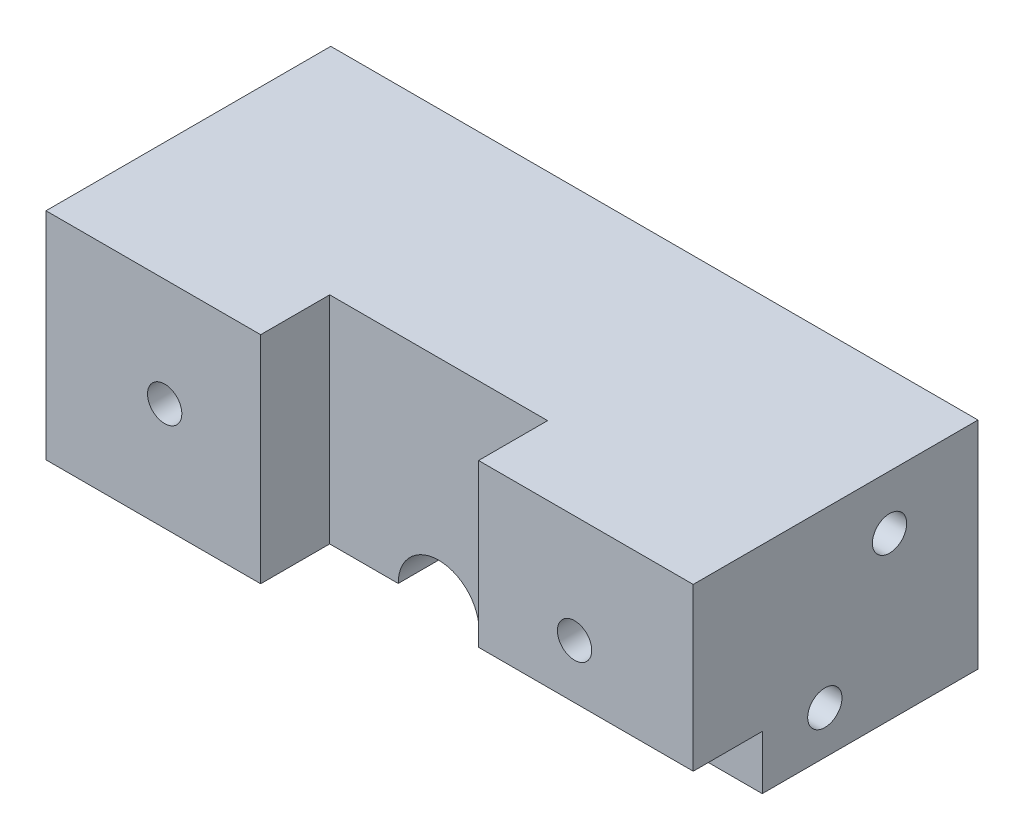
ISO-10303-21;
HEADER;
FILE_DESCRIPTION(('STEP AP214'),'2;1');
FILE_NAME('part.step','',(''),(''),'','','');
FILE_SCHEMA(('AUTOMOTIVE_DESIGN { 1 0 10303 214 1 1 1 1 }'));
ENDSEC;
DATA;
#1=APPLICATION_CONTEXT('core data for automotive mechanical design processes');
#2=APPLICATION_PROTOCOL_DEFINITION('international standard','automotive_design',2000,#1);
#3=PRODUCT_CONTEXT('',#1,'mechanical');
#4=PRODUCT('Part','Part','',(#3));
#5=PRODUCT_RELATED_PRODUCT_CATEGORY('part','',(#4));
#6=PRODUCT_DEFINITION_FORMATION('','',#4);
#7=PRODUCT_DEFINITION_CONTEXT('part definition',#1,'design');
#8=PRODUCT_DEFINITION('design','',#6,#7);
#9=PRODUCT_DEFINITION_SHAPE('','',#8);
#10=(LENGTH_UNIT() NAMED_UNIT(*) SI_UNIT(.MILLI.,.METRE.));
#11=(NAMED_UNIT(*) PLANE_ANGLE_UNIT() SI_UNIT($,.RADIAN.));
#12=(NAMED_UNIT(*) SI_UNIT($,.STERADIAN.) SOLID_ANGLE_UNIT());
#13=UNCERTAINTY_MEASURE_WITH_UNIT(LENGTH_MEASURE(1.E-05),#10,'distance_accuracy_value','');
#14=(GEOMETRIC_REPRESENTATION_CONTEXT(3) GLOBAL_UNCERTAINTY_ASSIGNED_CONTEXT((#13)) GLOBAL_UNIT_ASSIGNED_CONTEXT((#10,
#11,#12)) REPRESENTATION_CONTEXT('',''));
#15=CARTESIAN_POINT('',(0.,0.,0.));
#16=DIRECTION('',(0.,0.,1.));
#17=DIRECTION('',(1.,0.,0.));
#18=AXIS2_PLACEMENT_3D('',#15,#16,#17);
#19=CARTESIAN_POINT('',(0.,0.,-40.005));
#20=DIRECTION('',(0.,0.,-1.));
#21=DIRECTION('',(-1.,0.,0.));
#22=AXIS2_PLACEMENT_3D('',#19,#20,#21);
#23=PLANE('',#22);
#24=DIRECTION('',(0.,1.,0.));
#25=VECTOR('',#24,1.);
#26=CARTESIAN_POINT('',(38.1,-12.7,-40.005));
#27=LINE('',#26,#25);
#28=CARTESIAN_POINT('',(38.1,-6.35,-40.005));
#29=VERTEX_POINT('',#28);
#30=CARTESIAN_POINT('',(38.1,12.7,-40.005));
#31=VERTEX_POINT('',#30);
#32=EDGE_CURVE('E244',#29,#31,#27,.T.);
#33=ORIENTED_EDGE('',*,*,#32,.T.);
#34=DIRECTION('',(1.,0.,0.));
#35=VECTOR('',#34,1.);
#36=CARTESIAN_POINT('',(0.,12.7,-40.005));
#37=LINE('',#36,#35);
#38=CARTESIAN_POINT('',(12.827,12.7,-40.005));
#39=VERTEX_POINT('',#38);
#40=EDGE_CURVE('E243',#39,#31,#37,.T.);
#41=ORIENTED_EDGE('',*,*,#40,.F.);
#42=DIRECTION('',(0.,-1.,0.));
#43=VECTOR('',#42,1.);
#44=CARTESIAN_POINT('',(12.827,12.7,-40.005));
#45=LINE('',#44,#43);
#46=CARTESIAN_POINT('',(12.827,-6.35,-40.005));
#47=VERTEX_POINT('',#46);
#48=EDGE_CURVE('E11',#39,#47,#45,.T.);
#49=ORIENTED_EDGE('',*,*,#48,.T.);
#50=DIRECTION('',(-1.,0.,0.));
#51=VECTOR('',#50,1.);
#52=CARTESIAN_POINT('',(12.827,-6.35,-40.005));
#53=LINE('',#52,#51);
#54=EDGE_CURVE('E180',#29,#47,#53,.T.);
#55=ORIENTED_EDGE('',*,*,#54,.F.);
#56=EDGE_LOOP('',(#33,#41,#49,#55));
#57=FACE_BOUND('',#56,.T.);
#58=CARTESIAN_POINT('',(24.13,0.,-40.005));
#59=DIRECTION('',(0.,0.,-1.));
#60=DIRECTION('',(-1.,0.,0.));
#61=AXIS2_PLACEMENT_3D('',#58,#59,#60);
#62=CIRCLE('',#61,2.0193);
#63=CARTESIAN_POINT('',(22.1107,0.,-40.005));
#64=VERTEX_POINT('',#63);
#65=EDGE_CURVE('E249',#64,#64,#62,.F.);
#66=ORIENTED_EDGE('',*,*,#65,.F.);
#67=EDGE_LOOP('',(#66));
#68=FACE_BOUND('',#67,.T.);
#69=ADVANCED_FACE('F36',(#57,#68),#23,.F.);
#70=DIRECTION('',(1.,0.,0.));
#71=VECTOR('',#70,1.);
#72=CARTESIAN_POINT('',(0.,-12.7,-40.005));
#73=LINE('',#72,#71);
#74=CARTESIAN_POINT('',(-38.1,-12.7,-40.0049999999999));
#75=VERTEX_POINT('',#74);
#76=CARTESIAN_POINT('',(-12.827,-12.7,-40.005));
#77=VERTEX_POINT('',#76);
#78=EDGE_CURVE('E39',#75,#77,#73,.T.);
#79=ORIENTED_EDGE('',*,*,#78,.T.);
#80=DIRECTION('',(0.,-1.,0.));
#81=VECTOR('',#80,1.);
#82=CARTESIAN_POINT('',(-12.827,12.7,-40.005));
#83=LINE('',#82,#81);
#84=CARTESIAN_POINT('',(-12.827,12.7,-40.005));
#85=VERTEX_POINT('',#84);
#86=EDGE_CURVE('E203',#85,#77,#83,.T.);
#87=ORIENTED_EDGE('',*,*,#86,.F.);
#88=CARTESIAN_POINT('',(-38.1,12.7,-40.0049999999999));
#89=VERTEX_POINT('',#88);
#90=EDGE_CURVE('E241',#89,#85,#37,.T.);
#91=ORIENTED_EDGE('',*,*,#90,.F.);
#92=DIRECTION('',(0.,-1.,0.));
#93=VECTOR('',#92,1.);
#94=CARTESIAN_POINT('',(-38.1,-12.7,-40.0049999999999));
#95=LINE('',#94,#93);
#96=EDGE_CURVE('E44',#89,#75,#95,.T.);
#97=ORIENTED_EDGE('',*,*,#96,.T.);
#98=EDGE_LOOP('',(#79,#87,#91,#97));
#99=FACE_BOUND('',#98,.T.);
#100=CARTESIAN_POINT('',(-24.13,0.,-40.0049999999999));
#101=DIRECTION('',(0.,0.,-1.));
#102=DIRECTION('',(-1.,0.,0.));
#103=AXIS2_PLACEMENT_3D('',#100,#101,#102);
#104=CIRCLE('',#103,2.0193);
#105=CARTESIAN_POINT('',(-26.1493,0.,-40.0049999999999));
#106=VERTEX_POINT('',#105);
#107=EDGE_CURVE('E236',#106,#106,#104,.F.);
#108=ORIENTED_EDGE('',*,*,#107,.F.);
#109=EDGE_LOOP('',(#108));
#110=FACE_BOUND('',#109,.T.);
#111=ADVANCED_FACE('F254',(#99,#110),#23,.F.);
#112=CARTESIAN_POINT('',(-31.75,0.,-57.658));
#113=DIRECTION('',(0.,-1.,0.));
#114=DIRECTION('',(0.,0.,-1.));
#115=AXIS2_PLACEMENT_3D('',#112,#113,#114);
#116=PLANE('',#115);
#117=CARTESIAN_POINT('',(-31.75,0.,-57.658));
#118=DIRECTION('',(0.,-1.,0.));
#119=DIRECTION('',(0.,0.,-1.));
#120=AXIS2_PLACEMENT_3D('',#117,#118,#119);
#121=CIRCLE('',#120,2.0193);
#122=CARTESIAN_POINT('',(-31.75,0.,-59.6773));
#123=VERTEX_POINT('',#122);
#124=EDGE_CURVE('E152',#123,#123,#121,.T.);
#125=ORIENTED_EDGE('',*,*,#124,.T.);
#126=EDGE_LOOP('',(#125));
#127=FACE_BOUND('',#126,.T.);
#128=ADVANCED_FACE('F520',(#127),#116,.T.);
#129=CARTESIAN_POINT('',(-12.7,0.,-57.658));
#130=DIRECTION('',(0.,-1.,0.));
#131=DIRECTION('',(0.,0.,-1.));
#132=AXIS2_PLACEMENT_3D('',#129,#130,#131);
#133=PLANE('',#132);
#134=CARTESIAN_POINT('',(-12.7,0.,-57.658));
#135=DIRECTION('',(0.,-1.,0.));
#136=DIRECTION('',(0.,0.,-1.));
#137=AXIS2_PLACEMENT_3D('',#134,#135,#136);
#138=CIRCLE('',#137,2.0193);
#139=CARTESIAN_POINT('',(-12.7,0.,-59.6773));
#140=VERTEX_POINT('',#139);
#141=EDGE_CURVE('E146',#140,#140,#138,.T.);
#142=ORIENTED_EDGE('',*,*,#141,.T.);
#143=EDGE_LOOP('',(#142));
#144=FACE_BOUND('',#143,.T.);
#145=ADVANCED_FACE('F511',(#144),#133,.T.);
#146=CARTESIAN_POINT('',(23.9776,-7.62,-55.499));
#147=DIRECTION('',(1.,0.,0.));
#148=DIRECTION('',(0.,0.,-1.));
#149=AXIS2_PLACEMENT_3D('',#146,#147,#148);
#150=CONICAL_SURFACE('',#149,2.01929999999999,1.02974425867665);
#151=CARTESIAN_POINT('',(22.7642821519976,-7.62000000000001,-55.499));
#152=VERTEX_POINT('',#151);
#153=VERTEX_LOOP('',#152);
#154=FACE_BOUND('',#153,.T.);
#155=CARTESIAN_POINT('',(23.9776,-7.62,-55.499));
#156=DIRECTION('',(1.,0.,0.));
#157=DIRECTION('',(0.,0.,-1.));
#158=AXIS2_PLACEMENT_3D('',#155,#156,#157);
#159=CIRCLE('',#158,2.01929999999999);
#160=CARTESIAN_POINT('',(23.9776,-7.62,-57.5183));
#161=VERTEX_POINT('',#160);
#162=EDGE_CURVE('E138',#161,#161,#159,.T.);
#163=ORIENTED_EDGE('',*,*,#162,.T.);
#164=EDGE_LOOP('',(#163));
#165=FACE_BOUND('',#164,.T.);
#166=ADVANCED_FACE('F128',(#154,#165),#150,.F.);
#167=CARTESIAN_POINT('',(23.9776,6.35,-63.119));
#168=DIRECTION('',(1.,0.,0.));
#169=DIRECTION('',(0.,0.,-1.));
#170=AXIS2_PLACEMENT_3D('',#167,#168,#169);
#171=CONICAL_SURFACE('',#170,2.01929999999999,1.02974425867665);
#172=CARTESIAN_POINT('',(22.7642821519976,6.35,-63.119));
#173=VERTEX_POINT('',#172);
#174=VERTEX_LOOP('',#173);
#175=FACE_BOUND('',#174,.T.);
#176=CARTESIAN_POINT('',(23.9776,6.35,-63.119));
#177=DIRECTION('',(1.,0.,0.));
#178=DIRECTION('',(0.,0.,-1.));
#179=AXIS2_PLACEMENT_3D('',#176,#177,#178);
#180=CIRCLE('',#179,2.01929999999999);
#181=CARTESIAN_POINT('',(23.9776,6.35,-65.1383));
#182=VERTEX_POINT('',#181);
#183=EDGE_CURVE('E132',#182,#182,#180,.T.);
#184=ORIENTED_EDGE('',*,*,#183,.T.);
#185=EDGE_LOOP('',(#184));
#186=FACE_BOUND('',#185,.T.);
#187=ADVANCED_FACE('F124',(#175,#186),#171,.F.);
#188=CARTESIAN_POINT('',(24.13,0.,-68.072));
#189=DIRECTION('',(0.,0.,-1.));
#190=DIRECTION('',(-1.,0.,0.));
#191=AXIS2_PLACEMENT_3D('',#188,#189,#190);
#192=CYLINDRICAL_SURFACE('',#191,4.2164);
#193=CARTESIAN_POINT('',(24.13,0.,-68.072));
#194=DIRECTION('',(0.,0.,-1.));
#195=DIRECTION('',(-1.,0.,0.));
#196=AXIS2_PLACEMENT_3D('',#193,#194,#195);
#197=CIRCLE('',#196,4.2164);
#198=CARTESIAN_POINT('',(19.9136,0.,-68.072));
#199=VERTEX_POINT('',#198);
#200=EDGE_CURVE('E164',#199,#199,#197,.T.);
#201=ORIENTED_EDGE('',*,*,#200,.F.);
#202=EDGE_LOOP('',(#201));
#203=FACE_BOUND('',#202,.T.);
#204=CARTESIAN_POINT('',(24.13,0.,-73.533));
#205=DIRECTION('',(0.,0.,-1.));
#206=DIRECTION('',(-1.,0.,0.));
#207=AXIS2_PLACEMENT_3D('',#204,#205,#206);
#208=CIRCLE('',#207,4.2164);
#209=CARTESIAN_POINT('',(19.9136,0.,-73.533));
#210=VERTEX_POINT('',#209);
#211=EDGE_CURVE('E168',#210,#210,#208,.T.);
#212=ORIENTED_EDGE('',*,*,#211,.T.);
#213=EDGE_LOOP('',(#212));
#214=FACE_BOUND('',#213,.T.);
#215=ADVANCED_FACE('F127',(#203,#214),#192,.F.);
#216=CARTESIAN_POINT('',(24.13,0.,-68.072));
#217=DIRECTION('',(0.,0.,-1.));
#218=DIRECTION('',(-1.,0.,0.));
#219=AXIS2_PLACEMENT_3D('',#216,#217,#218);
#220=PLANE('',#219);
#221=ORIENTED_EDGE('',*,*,#200,.T.);
#222=EDGE_LOOP('',(#221));
#223=FACE_BOUND('',#222,.T.);
#224=CARTESIAN_POINT('',(24.13,0.,-68.072));
#225=DIRECTION('',(0.,0.,-1.));
#226=DIRECTION('',(-1.,0.,0.));
#227=AXIS2_PLACEMENT_3D('',#224,#225,#226);
#228=CIRCLE('',#227,2.0193);
#229=CARTESIAN_POINT('',(22.1107,0.,-68.072));
#230=VERTEX_POINT('',#229);
#231=EDGE_CURVE('E167',#230,#230,#228,.F.);
#232=ORIENTED_EDGE('',*,*,#231,.T.);
#233=EDGE_LOOP('',(#232));
#234=FACE_BOUND('',#233,.T.);
#235=ADVANCED_FACE('F308',(#223,#234),#220,.T.);
#236=CARTESIAN_POINT('',(24.13,0.,-16.383));
#237=DIRECTION('',(0.,0.,-1.));
#238=DIRECTION('',(-1.,0.,0.));
#239=AXIS2_PLACEMENT_3D('',#236,#237,#238);
#240=CYLINDRICAL_SURFACE('',#239,2.0193);
#241=ORIENTED_EDGE('',*,*,#65,.T.);
#242=EDGE_LOOP('',(#241));
#243=FACE_BOUND('',#242,.T.);
#244=ORIENTED_EDGE('',*,*,#231,.F.);
#245=EDGE_LOOP('',(#244));
#246=FACE_BOUND('',#245,.T.);
#247=ADVANCED_FACE('F304',(#243,#246),#240,.F.);
#248=CARTESIAN_POINT('',(-24.13,0.,-68.072));
#249=DIRECTION('',(0.,0.,-1.));
#250=DIRECTION('',(-1.,0.,0.));
#251=AXIS2_PLACEMENT_3D('',#248,#249,#250);
#252=CYLINDRICAL_SURFACE('',#251,4.2164);
#253=CARTESIAN_POINT('',(-24.13,0.,-68.072));
#254=DIRECTION('',(0.,0.,-1.));
#255=DIRECTION('',(-1.,0.,0.));
#256=AXIS2_PLACEMENT_3D('',#253,#254,#255);
#257=CIRCLE('',#256,4.2164);
#258=CARTESIAN_POINT('',(-28.3464,0.,-68.072));
#259=VERTEX_POINT('',#258);
#260=EDGE_CURVE('E158',#259,#259,#257,.T.);
#261=ORIENTED_EDGE('',*,*,#260,.F.);
#262=EDGE_LOOP('',(#261));
#263=FACE_BOUND('',#262,.T.);
#264=CARTESIAN_POINT('',(-24.13,0.,-73.533));
#265=DIRECTION('',(0.,0.,-1.));
#266=DIRECTION('',(-1.,0.,0.));
#267=AXIS2_PLACEMENT_3D('',#264,#265,#266);
#268=CIRCLE('',#267,4.2164);
#269=CARTESIAN_POINT('',(-28.3464,0.,-73.533));
#270=VERTEX_POINT('',#269);
#271=EDGE_CURVE('E155',#270,#270,#268,.T.);
#272=ORIENTED_EDGE('',*,*,#271,.T.);
#273=EDGE_LOOP('',(#272));
#274=FACE_BOUND('',#273,.T.);
#275=ADVANCED_FACE('F307',(#263,#274),#252,.F.);
#276=CARTESIAN_POINT('',(-24.13,0.,-68.072));
#277=DIRECTION('',(0.,0.,-1.));
#278=DIRECTION('',(-1.,0.,0.));
#279=AXIS2_PLACEMENT_3D('',#276,#277,#278);
#280=PLANE('',#279);
#281=ORIENTED_EDGE('',*,*,#260,.T.);
#282=EDGE_LOOP('',(#281));
#283=FACE_BOUND('',#282,.T.);
#284=CARTESIAN_POINT('',(-24.13,0.,-68.072));
#285=DIRECTION('',(0.,0.,-1.));
#286=DIRECTION('',(-1.,0.,0.));
#287=AXIS2_PLACEMENT_3D('',#284,#285,#286);
#288=CIRCLE('',#287,2.0193);
#289=CARTESIAN_POINT('',(-26.1493,0.,-68.072));
#290=VERTEX_POINT('',#289);
#291=EDGE_CURVE('E161',#290,#290,#288,.F.);
#292=ORIENTED_EDGE('',*,*,#291,.T.);
#293=EDGE_LOOP('',(#292));
#294=FACE_BOUND('',#293,.T.);
#295=ADVANCED_FACE('F326',(#283,#294),#280,.T.);
#296=CARTESIAN_POINT('',(-24.13,0.,-16.383));
#297=DIRECTION('',(0.,0.,-1.));
#298=DIRECTION('',(-1.,0.,0.));
#299=AXIS2_PLACEMENT_3D('',#296,#297,#298);
#300=CYLINDRICAL_SURFACE('',#299,2.0193);
#301=ORIENTED_EDGE('',*,*,#107,.T.);
#302=EDGE_LOOP('',(#301));
#303=FACE_BOUND('',#302,.T.);
#304=ORIENTED_EDGE('',*,*,#291,.F.);
#305=EDGE_LOOP('',(#304));
#306=FACE_BOUND('',#305,.T.);
#307=ADVANCED_FACE('F323',(#303,#306),#300,.F.);
#308=CARTESIAN_POINT('',(-31.75,0.,-57.658));
#309=DIRECTION('',(0.,-1.,0.));
#310=DIRECTION('',(0.,0.,-1.));
#311=AXIS2_PLACEMENT_3D('',#308,#309,#310);
#312=CYLINDRICAL_SURFACE('',#311,2.0193);
#313=ORIENTED_EDGE('',*,*,#124,.F.);
#314=EDGE_LOOP('',(#313));
#315=FACE_BOUND('',#314,.T.);
#316=CARTESIAN_POINT('',(-31.75,-12.7,-57.658));
#317=DIRECTION('',(0.,-1.,0.));
#318=DIRECTION('',(0.,0.,-1.));
#319=AXIS2_PLACEMENT_3D('',#316,#317,#318);
#320=CIRCLE('',#319,2.0193);
#321=CARTESIAN_POINT('',(-31.75,-12.7,-59.6773));
#322=VERTEX_POINT('',#321);
#323=EDGE_CURVE('E149',#322,#322,#320,.T.);
#324=ORIENTED_EDGE('',*,*,#323,.T.);
#325=EDGE_LOOP('',(#324));
#326=FACE_BOUND('',#325,.T.);
#327=ADVANCED_FACE('F325',(#315,#326),#312,.F.);
#328=CARTESIAN_POINT('',(-12.7,0.,-57.658));
#329=DIRECTION('',(0.,-1.,0.));
#330=DIRECTION('',(0.,0.,-1.));
#331=AXIS2_PLACEMENT_3D('',#328,#329,#330);
#332=CYLINDRICAL_SURFACE('',#331,2.0193);
#333=ORIENTED_EDGE('',*,*,#141,.F.);
#334=EDGE_LOOP('',(#333));
#335=FACE_BOUND('',#334,.T.);
#336=CARTESIAN_POINT('',(-12.7,-12.7,-57.658));
#337=DIRECTION('',(0.,-1.,0.));
#338=DIRECTION('',(0.,0.,-1.));
#339=AXIS2_PLACEMENT_3D('',#336,#337,#338);
#340=CIRCLE('',#339,2.0193);
#341=CARTESIAN_POINT('',(-12.7,-12.7,-59.6773));
#342=VERTEX_POINT('',#341);
#343=EDGE_CURVE('E145',#342,#342,#340,.T.);
#344=ORIENTED_EDGE('',*,*,#343,.T.);
#345=EDGE_LOOP('',(#344));
#346=FACE_BOUND('',#345,.T.);
#347=ADVANCED_FACE('F340',(#335,#346),#332,.F.);
#348=CARTESIAN_POINT('',(0.,-12.7,-48.133));
#349=DIRECTION('',(0.,0.,-1.));
#350=DIRECTION('',(-1.,0.,0.));
#351=AXIS2_PLACEMENT_3D('',#348,#349,#350);
#352=CYLINDRICAL_SURFACE('',#351,4.7625);
#353=DIRECTION('',(0.,0.,-1.));
#354=VECTOR('',#353,1.);
#355=CARTESIAN_POINT('',(-4.7625,-12.7,-48.133));
#356=LINE('',#355,#354);
#357=CARTESIAN_POINT('',(-4.7625,-12.7,-48.133));
#358=VERTEX_POINT('',#357);
#359=CARTESIAN_POINT('',(-4.7625,-12.7,-73.533));
#360=VERTEX_POINT('',#359);
#361=EDGE_CURVE('E234',#358,#360,#356,.T.);
#362=ORIENTED_EDGE('',*,*,#361,.T.);
#363=CARTESIAN_POINT('',(0.,-12.7,-73.533));
#364=DIRECTION('',(0.,0.,-1.));
#365=DIRECTION('',(-1.,0.,0.));
#366=AXIS2_PLACEMENT_3D('',#363,#364,#365);
#367=CIRCLE('',#366,4.7625);
#368=CARTESIAN_POINT('',(4.7625,-12.7,-73.533));
#369=VERTEX_POINT('',#368);
#370=EDGE_CURVE('E206',#360,#369,#367,.T.);
#371=ORIENTED_EDGE('',*,*,#370,.T.);
#372=DIRECTION('',(0.,0.,-1.));
#373=VECTOR('',#372,1.);
#374=CARTESIAN_POINT('',(4.7625,-12.7,-48.133));
#375=LINE('',#374,#373);
#376=CARTESIAN_POINT('',(4.7625,-12.7,-48.133));
#377=VERTEX_POINT('',#376);
#378=EDGE_CURVE('E229',#369,#377,#375,.F.);
#379=ORIENTED_EDGE('',*,*,#378,.T.);
#380=CARTESIAN_POINT('',(0.,-12.7,-48.133));
#381=DIRECTION('',(0.,0.,-1.));
#382=DIRECTION('',(-1.,0.,0.));
#383=AXIS2_PLACEMENT_3D('',#380,#381,#382);
#384=CIRCLE('',#383,4.7625);
#385=EDGE_CURVE('E207',#358,#377,#384,.T.);
#386=ORIENTED_EDGE('',*,*,#385,.F.);
#387=EDGE_LOOP('',(#362,#371,#379,#386));
#388=FACE_BOUND('',#387,.T.);
#389=ADVANCED_FACE('F286',(#388),#352,.F.);
#390=CARTESIAN_POINT('',(38.1,-7.62,-55.499));
#391=DIRECTION('',(1.,0.,0.));
#392=DIRECTION('',(0.,0.,-1.));
#393=AXIS2_PLACEMENT_3D('',#390,#391,#392);
#394=CYLINDRICAL_SURFACE('',#393,2.01929999999999);
#395=ORIENTED_EDGE('',*,*,#162,.F.);
#396=EDGE_LOOP('',(#395));
#397=FACE_BOUND('',#396,.T.);
#398=CARTESIAN_POINT('',(38.1,-7.62,-55.499));
#399=DIRECTION('',(1.,0.,0.));
#400=DIRECTION('',(0.,0.,-1.));
#401=AXIS2_PLACEMENT_3D('',#398,#399,#400);
#402=CIRCLE('',#401,2.01929999999999);
#403=CARTESIAN_POINT('',(38.1,-7.62,-57.5183));
#404=VERTEX_POINT('',#403);
#405=EDGE_CURVE('E134',#404,#404,#402,.T.);
#406=ORIENTED_EDGE('',*,*,#405,.T.);
#407=EDGE_LOOP('',(#406));
#408=FACE_BOUND('',#407,.T.);
#409=ADVANCED_FACE('F339',(#397,#408),#394,.F.);
#410=CARTESIAN_POINT('',(38.1,6.35,-63.119));
#411=DIRECTION('',(1.,0.,0.));
#412=DIRECTION('',(0.,0.,-1.));
#413=AXIS2_PLACEMENT_3D('',#410,#411,#412);
#414=CYLINDRICAL_SURFACE('',#413,2.01929999999999);
#415=ORIENTED_EDGE('',*,*,#183,.F.);
#416=EDGE_LOOP('',(#415));
#417=FACE_BOUND('',#416,.T.);
#418=CARTESIAN_POINT('',(38.1,6.35,-63.119));
#419=DIRECTION('',(1.,0.,0.));
#420=DIRECTION('',(0.,0.,-1.));
#421=AXIS2_PLACEMENT_3D('',#418,#419,#420);
#422=CIRCLE('',#421,2.01929999999999);
#423=CARTESIAN_POINT('',(38.1,6.35,-65.1383));
#424=VERTEX_POINT('',#423);
#425=EDGE_CURVE('E135',#424,#424,#422,.T.);
#426=ORIENTED_EDGE('',*,*,#425,.T.);
#427=EDGE_LOOP('',(#426));
#428=FACE_BOUND('',#427,.T.);
#429=ADVANCED_FACE('F345',(#417,#428),#414,.F.);
#430=CARTESIAN_POINT('',(0.,-12.7,0.));
#431=DIRECTION('',(0.,-1.,0.));
#432=DIRECTION('',(0.,0.,-1.));
#433=AXIS2_PLACEMENT_3D('',#430,#431,#432);
#434=PLANE('',#433);
#435=DIRECTION('',(0.,0.,-1.));
#436=VECTOR('',#435,1.);
#437=CARTESIAN_POINT('',(38.1,-12.7,73.533));
#438=LINE('',#437,#436);
#439=CARTESIAN_POINT('',(38.1,-12.7,-48.133));
#440=VERTEX_POINT('',#439);
#441=CARTESIAN_POINT('',(38.1,-12.7,-73.533));
#442=VERTEX_POINT('',#441);
#443=EDGE_CURVE('E218',#440,#442,#438,.T.);
#444=ORIENTED_EDGE('',*,*,#443,.F.);
#445=DIRECTION('',(-1.,0.,0.));
#446=VECTOR('',#445,1.);
#447=CARTESIAN_POINT('',(12.827,-12.7,-48.133));
#448=LINE('',#447,#446);
#449=EDGE_CURVE('E189',#440,#377,#448,.T.);
#450=ORIENTED_EDGE('',*,*,#449,.T.);
#451=ORIENTED_EDGE('',*,*,#378,.F.);
#452=DIRECTION('',(-1.,0.,0.));
#453=VECTOR('',#452,1.);
#454=CARTESIAN_POINT('',(-38.1,-12.7,-73.533));
#455=LINE('',#454,#453);
#456=EDGE_CURVE('E221',#442,#369,#455,.T.);
#457=ORIENTED_EDGE('',*,*,#456,.F.);
#458=EDGE_LOOP('',(#444,#450,#451,#457));
#459=FACE_BOUND('',#458,.T.);
#460=ADVANCED_FACE('F283',(#459),#434,.T.);
#461=CARTESIAN_POINT('',(-38.1,-12.7,-73.533));
#462=DIRECTION('',(0.,0.,-1.));
#463=DIRECTION('',(-1.,0.,0.));
#464=AXIS2_PLACEMENT_3D('',#461,#462,#463);
#465=PLANE('',#464);
#466=ORIENTED_EDGE('',*,*,#271,.F.);
#467=EDGE_LOOP('',(#466));
#468=FACE_BOUND('',#467,.T.);
#469=ORIENTED_EDGE('',*,*,#211,.F.);
#470=EDGE_LOOP('',(#469));
#471=FACE_BOUND('',#470,.T.);
#472=ORIENTED_EDGE('',*,*,#370,.F.);
#473=CARTESIAN_POINT('',(-38.1,-12.7,-73.533));
#474=VERTEX_POINT('',#473);
#475=EDGE_CURVE('E220',#360,#474,#455,.T.);
#476=ORIENTED_EDGE('',*,*,#475,.T.);
#477=DIRECTION('',(0.,1.,0.));
#478=VECTOR('',#477,1.);
#479=CARTESIAN_POINT('',(-38.1,-12.7,-73.533));
#480=LINE('',#479,#478);
#481=CARTESIAN_POINT('',(-38.1,12.7,-73.533));
#482=VERTEX_POINT('',#481);
#483=EDGE_CURVE('E227',#474,#482,#480,.T.);
#484=ORIENTED_EDGE('',*,*,#483,.T.);
#485=DIRECTION('',(-1.,0.,0.));
#486=VECTOR('',#485,1.);
#487=CARTESIAN_POINT('',(-38.1,12.7,-73.533));
#488=LINE('',#487,#486);
#489=CARTESIAN_POINT('',(38.1,12.7,-73.533));
#490=VERTEX_POINT('',#489);
#491=EDGE_CURVE('E212',#490,#482,#488,.T.);
#492=ORIENTED_EDGE('',*,*,#491,.F.);
#493=DIRECTION('',(0.,1.,0.));
#494=VECTOR('',#493,1.);
#495=CARTESIAN_POINT('',(38.1,-12.7,-73.533));
#496=LINE('',#495,#494);
#497=EDGE_CURVE('E226',#442,#490,#496,.T.);
#498=ORIENTED_EDGE('',*,*,#497,.F.);
#499=ORIENTED_EDGE('',*,*,#456,.T.);
#500=EDGE_LOOP('',(#472,#476,#484,#492,#498,#499));
#501=FACE_BOUND('',#500,.T.);
#502=ADVANCED_FACE('F269',(#468,#471,#501),#465,.T.);
#503=ORIENTED_EDGE('',*,*,#78,.F.);
#504=DIRECTION('',(0.,0.,1.));
#505=VECTOR('',#504,1.);
#506=CARTESIAN_POINT('',(-38.1,-12.7,73.533));
#507=LINE('',#506,#505);
#508=EDGE_CURVE('E224',#474,#75,#507,.T.);
#509=ORIENTED_EDGE('',*,*,#508,.F.);
#510=ORIENTED_EDGE('',*,*,#475,.F.);
#511=ORIENTED_EDGE('',*,*,#361,.F.);
#512=CARTESIAN_POINT('',(-12.827,-12.7,-48.133));
#513=VERTEX_POINT('',#512);
#514=EDGE_CURVE('E188',#358,#513,#448,.T.);
#515=ORIENTED_EDGE('',*,*,#514,.T.);
#516=DIRECTION('',(0.,0.,1.));
#517=VECTOR('',#516,1.);
#518=CARTESIAN_POINT('',(-12.827,-12.7,-40.005));
#519=LINE('',#518,#517);
#520=EDGE_CURVE('E185',#513,#77,#519,.T.);
#521=ORIENTED_EDGE('',*,*,#520,.T.);
#522=EDGE_LOOP('',(#503,#509,#510,#511,#515,#521));
#523=FACE_BOUND('',#522,.T.);
#524=ORIENTED_EDGE('',*,*,#343,.F.);
#525=EDGE_LOOP('',(#524));
#526=FACE_BOUND('',#525,.T.);
#527=ORIENTED_EDGE('',*,*,#323,.F.);
#528=EDGE_LOOP('',(#527));
#529=FACE_BOUND('',#528,.T.);
#530=ADVANCED_FACE('F259',(#523,#526,#529),#434,.T.);
#531=CARTESIAN_POINT('',(0.,12.7,0.));
#532=DIRECTION('',(0.,-1.,0.));
#533=DIRECTION('',(0.,0.,-1.));
#534=AXIS2_PLACEMENT_3D('',#531,#532,#533);
#535=PLANE('',#534);
#536=DIRECTION('',(0.,0.,1.));
#537=VECTOR('',#536,1.);
#538=CARTESIAN_POINT('',(-38.1,12.7,73.533));
#539=LINE('',#538,#537);
#540=EDGE_CURVE('E215',#482,#89,#539,.T.);
#541=ORIENTED_EDGE('',*,*,#540,.T.);
#542=ORIENTED_EDGE('',*,*,#90,.T.);
#543=DIRECTION('',(0.,0.,1.));
#544=VECTOR('',#543,1.);
#545=CARTESIAN_POINT('',(-12.827,12.7,-40.005));
#546=LINE('',#545,#544);
#547=CARTESIAN_POINT('',(-12.827,12.7,-48.133));
#548=VERTEX_POINT('',#547);
#549=EDGE_CURVE('E192',#548,#85,#546,.T.);
#550=ORIENTED_EDGE('',*,*,#549,.F.);
#551=DIRECTION('',(-1.,0.,0.));
#552=VECTOR('',#551,1.);
#553=CARTESIAN_POINT('',(12.827,12.7,-48.133));
#554=LINE('',#553,#552);
#555=CARTESIAN_POINT('',(12.827,12.7,-48.133));
#556=VERTEX_POINT('',#555);
#557=EDGE_CURVE('E197',#556,#548,#554,.T.);
#558=ORIENTED_EDGE('',*,*,#557,.F.);
#559=DIRECTION('',(0.,0.,-1.));
#560=VECTOR('',#559,1.);
#561=CARTESIAN_POINT('',(12.827,12.7,-40.005));
#562=LINE('',#561,#560);
#563=EDGE_CURVE('E195',#39,#556,#562,.T.);
#564=ORIENTED_EDGE('',*,*,#563,.F.);
#565=ORIENTED_EDGE('',*,*,#40,.T.);
#566=DIRECTION('',(0.,0.,-1.));
#567=VECTOR('',#566,1.);
#568=CARTESIAN_POINT('',(38.1,12.7,73.533));
#569=LINE('',#568,#567);
#570=EDGE_CURVE('E209',#31,#490,#569,.T.);
#571=ORIENTED_EDGE('',*,*,#570,.T.);
#572=ORIENTED_EDGE('',*,*,#491,.T.);
#573=EDGE_LOOP('',(#541,#542,#550,#558,#564,#565,#571,#572));
#574=FACE_BOUND('',#573,.T.);
#575=ADVANCED_FACE('F272',(#574),#535,.F.);
#576=CARTESIAN_POINT('',(38.1,-12.7,73.533));
#577=DIRECTION('',(1.,0.,0.));
#578=DIRECTION('',(0.,0.,-1.));
#579=AXIS2_PLACEMENT_3D('',#576,#577,#578);
#580=PLANE('',#579);
#581=ORIENTED_EDGE('',*,*,#32,.F.);
#582=DIRECTION('',(0.,0.,1.));
#583=VECTOR('',#582,1.);
#584=CARTESIAN_POINT('',(38.1,-6.35,-40.005));
#585=LINE('',#584,#583);
#586=CARTESIAN_POINT('',(38.1,-6.35,-48.133));
#587=VERTEX_POINT('',#586);
#588=EDGE_CURVE('E177',#587,#29,#585,.T.);
#589=ORIENTED_EDGE('',*,*,#588,.F.);
#590=DIRECTION('',(0.,-1.,0.));
#591=VECTOR('',#590,1.);
#592=CARTESIAN_POINT('',(38.1,-6.35,-48.133));
#593=LINE('',#592,#591);
#594=EDGE_CURVE('E182',#587,#440,#593,.T.);
#595=ORIENTED_EDGE('',*,*,#594,.T.);
#596=ORIENTED_EDGE('',*,*,#443,.T.);
#597=ORIENTED_EDGE('',*,*,#497,.T.);
#598=ORIENTED_EDGE('',*,*,#570,.F.);
#599=EDGE_LOOP('',(#581,#589,#595,#596,#597,#598));
#600=FACE_BOUND('',#599,.T.);
#601=ORIENTED_EDGE('',*,*,#425,.F.);
#602=EDGE_LOOP('',(#601));
#603=FACE_BOUND('',#602,.T.);
#604=ORIENTED_EDGE('',*,*,#405,.F.);
#605=EDGE_LOOP('',(#604));
#606=FACE_BOUND('',#605,.T.);
#607=ADVANCED_FACE('F277',(#600,#603,#606),#580,.T.);
#608=CARTESIAN_POINT('',(12.827,12.7,-48.133));
#609=DIRECTION('',(0.,0.,1.));
#610=DIRECTION('',(1.,0.,0.));
#611=AXIS2_PLACEMENT_3D('',#608,#609,#610);
#612=PLANE('',#611);
#613=ORIENTED_EDGE('',*,*,#385,.T.);
#614=ORIENTED_EDGE('',*,*,#449,.F.);
#615=ORIENTED_EDGE('',*,*,#594,.F.);
#616=DIRECTION('',(1.,0.,0.));
#617=VECTOR('',#616,1.);
#618=CARTESIAN_POINT('',(12.827,-6.35,-48.133));
#619=LINE('',#618,#617);
#620=CARTESIAN_POINT('',(12.827,-6.35,-48.133));
#621=VERTEX_POINT('',#620);
#622=EDGE_CURVE('E174',#621,#587,#619,.T.);
#623=ORIENTED_EDGE('',*,*,#622,.F.);
#624=DIRECTION('',(0.,-1.,0.));
#625=VECTOR('',#624,1.);
#626=CARTESIAN_POINT('',(12.827,12.7,-48.133));
#627=LINE('',#626,#625);
#628=EDGE_CURVE('E201',#556,#621,#627,.T.);
#629=ORIENTED_EDGE('',*,*,#628,.F.);
#630=ORIENTED_EDGE('',*,*,#557,.T.);
#631=DIRECTION('',(0.,-1.,0.));
#632=VECTOR('',#631,1.);
#633=CARTESIAN_POINT('',(-12.827,12.7,-48.133));
#634=LINE('',#633,#632);
#635=EDGE_CURVE('E199',#548,#513,#634,.T.);
#636=ORIENTED_EDGE('',*,*,#635,.T.);
#637=ORIENTED_EDGE('',*,*,#514,.F.);
#638=EDGE_LOOP('',(#613,#614,#615,#623,#629,#630,#636,#637));
#639=FACE_BOUND('',#638,.T.);
#640=ADVANCED_FACE('F289',(#639),#612,.T.);
#641=CARTESIAN_POINT('',(12.827,12.7,-40.005));
#642=DIRECTION('',(-1.,0.,0.));
#643=DIRECTION('',(0.,0.,1.));
#644=AXIS2_PLACEMENT_3D('',#641,#642,#643);
#645=PLANE('',#644);
#646=ORIENTED_EDGE('',*,*,#628,.T.);
#647=DIRECTION('',(0.,0.,-1.));
#648=VECTOR('',#647,1.);
#649=CARTESIAN_POINT('',(12.827,-6.35,-40.005));
#650=LINE('',#649,#648);
#651=EDGE_CURVE('E171',#47,#621,#650,.T.);
#652=ORIENTED_EDGE('',*,*,#651,.F.);
#653=ORIENTED_EDGE('',*,*,#48,.F.);
#654=ORIENTED_EDGE('',*,*,#563,.T.);
#655=EDGE_LOOP('',(#646,#652,#653,#654));
#656=FACE_BOUND('',#655,.T.);
#657=ADVANCED_FACE('F295',(#656),#645,.T.);
#658=CARTESIAN_POINT('',(0.,-6.35,0.));
#659=DIRECTION('',(0.,-1.,0.));
#660=DIRECTION('',(0.,0.,-1.));
#661=AXIS2_PLACEMENT_3D('',#658,#659,#660);
#662=PLANE('',#661);
#663=ORIENTED_EDGE('',*,*,#651,.T.);
#664=ORIENTED_EDGE('',*,*,#622,.T.);
#665=ORIENTED_EDGE('',*,*,#588,.T.);
#666=ORIENTED_EDGE('',*,*,#54,.T.);
#667=EDGE_LOOP('',(#663,#664,#665,#666));
#668=FACE_BOUND('',#667,.T.);
#669=ADVANCED_FACE('F298',(#668),#662,.T.);
#670=CARTESIAN_POINT('',(-12.827,12.7,-40.005));
#671=DIRECTION('',(1.,0.,0.));
#672=DIRECTION('',(0.,0.,-1.));
#673=AXIS2_PLACEMENT_3D('',#670,#671,#672);
#674=PLANE('',#673);
#675=ORIENTED_EDGE('',*,*,#635,.F.);
#676=ORIENTED_EDGE('',*,*,#549,.T.);
#677=ORIENTED_EDGE('',*,*,#86,.T.);
#678=ORIENTED_EDGE('',*,*,#520,.F.);
#679=EDGE_LOOP('',(#675,#676,#677,#678));
#680=FACE_BOUND('',#679,.T.);
#681=ADVANCED_FACE('F294',(#680),#674,.T.);
#682=CARTESIAN_POINT('',(-38.1,-12.7,73.533));
#683=DIRECTION('',(-1.,0.,0.));
#684=DIRECTION('',(0.,0.,1.));
#685=AXIS2_PLACEMENT_3D('',#682,#683,#684);
#686=PLANE('',#685);
#687=ORIENTED_EDGE('',*,*,#96,.F.);
#688=ORIENTED_EDGE('',*,*,#540,.F.);
#689=ORIENTED_EDGE('',*,*,#483,.F.);
#690=ORIENTED_EDGE('',*,*,#508,.T.);
#691=EDGE_LOOP('',(#687,#688,#689,#690));
#692=FACE_BOUND('',#691,.T.);
#693=ADVANCED_FACE('F265',(#692),#686,.T.);
#694=CLOSED_SHELL('',(#69,#111,#128,#145,#166,#187,#215,#235,#247,#275,#295,#307,#327,#347,#389,
#409,#429,#460,#502,#530,#575,#607,#640,#657,#669,#681,#693));
#695=MANIFOLD_SOLID_BREP('B2',#694);
#696=ADVANCED_BREP_SHAPE_REPRESENTATION('',(#18,#695),#14);
#697=SHAPE_DEFINITION_REPRESENTATION(#9,#696);
ENDSEC;
END-ISO-10303-21;
